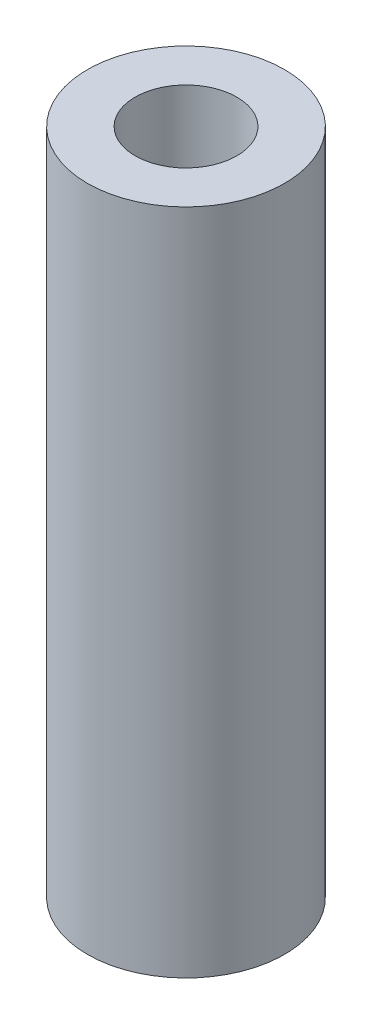
ISO-10303-21;
HEADER;
FILE_DESCRIPTION(('STEP AP214'),'2;1');
FILE_NAME('part.step','',(''),(''),'','','');
FILE_SCHEMA(('AUTOMOTIVE_DESIGN { 1 0 10303 214 1 1 1 1 }'));
ENDSEC;
DATA;
#1=APPLICATION_CONTEXT('core data for automotive mechanical design processes');
#2=APPLICATION_PROTOCOL_DEFINITION('international standard','automotive_design',2000,#1);
#3=PRODUCT_CONTEXT('',#1,'mechanical');
#4=PRODUCT('Part','Part','',(#3));
#5=PRODUCT_RELATED_PRODUCT_CATEGORY('part','',(#4));
#6=PRODUCT_DEFINITION_FORMATION('','',#4);
#7=PRODUCT_DEFINITION_CONTEXT('part definition',#1,'design');
#8=PRODUCT_DEFINITION('design','',#6,#7);
#9=PRODUCT_DEFINITION_SHAPE('','',#8);
#10=(LENGTH_UNIT() NAMED_UNIT(*) SI_UNIT(.MILLI.,.METRE.));
#11=(NAMED_UNIT(*) PLANE_ANGLE_UNIT() SI_UNIT($,.RADIAN.));
#12=(NAMED_UNIT(*) SI_UNIT($,.STERADIAN.) SOLID_ANGLE_UNIT());
#13=UNCERTAINTY_MEASURE_WITH_UNIT(LENGTH_MEASURE(1.E-05),#10,'distance_accuracy_value','');
#14=(GEOMETRIC_REPRESENTATION_CONTEXT(3) GLOBAL_UNCERTAINTY_ASSIGNED_CONTEXT((#13)) GLOBAL_UNIT_ASSIGNED_CONTEXT((#10,
#11,#12)) REPRESENTATION_CONTEXT('',''));
#15=CARTESIAN_POINT('',(0.,0.,0.));
#16=DIRECTION('',(0.,0.,1.));
#17=DIRECTION('',(1.,0.,0.));
#18=AXIS2_PLACEMENT_3D('',#15,#16,#17);
#19=CARTESIAN_POINT('',(0.,21.,0.));
#20=DIRECTION('',(0.,1.,0.));
#21=DIRECTION('',(0.,0.,1.));
#22=AXIS2_PLACEMENT_3D('',#19,#20,#21);
#23=PLANE('',#22);
#24=CARTESIAN_POINT('',(0.,21.,0.));
#25=DIRECTION('',(0.,1.,0.));
#26=DIRECTION('',(0.,0.,1.));
#27=AXIS2_PLACEMENT_3D('',#24,#25,#26);
#28=CIRCLE('',#27,3.1);
#29=CARTESIAN_POINT('',(0.,21.,-3.1));
#30=VERTEX_POINT('',#29);
#31=EDGE_CURVE('E10',#30,#30,#28,.T.);
#32=ORIENTED_EDGE('',*,*,#31,.T.);
#33=EDGE_LOOP('',(#32));
#34=FACE_BOUND('',#33,.T.);
#35=CARTESIAN_POINT('',(0.,21.,0.));
#36=DIRECTION('',(0.,1.,0.));
#37=DIRECTION('',(0.,0.,1.));
#38=AXIS2_PLACEMENT_3D('',#35,#36,#37);
#39=CIRCLE('',#38,1.6);
#40=CARTESIAN_POINT('',(0.,21.,-1.6));
#41=VERTEX_POINT('',#40);
#42=EDGE_CURVE('E50',#41,#41,#39,.T.);
#43=ORIENTED_EDGE('',*,*,#42,.F.);
#44=EDGE_LOOP('',(#43));
#45=FACE_BOUND('',#44,.T.);
#46=ADVANCED_FACE('F37',(#34,#45),#23,.T.);
#47=CARTESIAN_POINT('',(0.,0.,0.));
#48=DIRECTION('',(0.,1.,0.));
#49=DIRECTION('',(0.,0.,1.));
#50=AXIS2_PLACEMENT_3D('',#47,#48,#49);
#51=PLANE('',#50);
#52=CARTESIAN_POINT('',(0.,0.,0.));
#53=DIRECTION('',(0.,1.,0.));
#54=DIRECTION('',(0.,0.,1.));
#55=AXIS2_PLACEMENT_3D('',#52,#53,#54);
#56=CIRCLE('',#55,3.1);
#57=CARTESIAN_POINT('',(0.,0.,-3.1));
#58=VERTEX_POINT('',#57);
#59=EDGE_CURVE('E41',#58,#58,#56,.T.);
#60=ORIENTED_EDGE('',*,*,#59,.F.);
#61=EDGE_LOOP('',(#60));
#62=FACE_BOUND('',#61,.T.);
#63=CARTESIAN_POINT('',(0.,0.,0.));
#64=DIRECTION('',(0.,1.,0.));
#65=DIRECTION('',(0.,0.,1.));
#66=AXIS2_PLACEMENT_3D('',#63,#64,#65);
#67=CIRCLE('',#66,1.6);
#68=CARTESIAN_POINT('',(0.,0.,-1.6));
#69=VERTEX_POINT('',#68);
#70=EDGE_CURVE('E52',#69,#69,#67,.T.);
#71=ORIENTED_EDGE('',*,*,#70,.T.);
#72=EDGE_LOOP('',(#71));
#73=FACE_BOUND('',#72,.T.);
#74=ADVANCED_FACE('F64',(#62,#73),#51,.F.);
#75=CARTESIAN_POINT('',(0.,21.,0.));
#76=DIRECTION('',(0.,-1.,0.));
#77=DIRECTION('',(0.,0.,-1.));
#78=AXIS2_PLACEMENT_3D('',#75,#76,#77);
#79=CYLINDRICAL_SURFACE('',#78,3.1);
#80=CARTESIAN_POINT('',(0.,21.,-3.1));
#81=CARTESIAN_POINT('',(0.,20.78125,-3.1));
#82=CARTESIAN_POINT('',(0.,20.5625,-3.1));
#83=CARTESIAN_POINT('',(0.,20.125,-3.1));
#84=CARTESIAN_POINT('',(0.,19.90625,-3.1));
#85=CARTESIAN_POINT('',(0.,19.46875,-3.1));
#86=CARTESIAN_POINT('',(0.,19.25,-3.1));
#87=CARTESIAN_POINT('',(0.,18.8125,-3.1));
#88=CARTESIAN_POINT('',(0.,18.59375,-3.1));
#89=CARTESIAN_POINT('',(0.,18.15625,-3.1));
#90=CARTESIAN_POINT('',(0.,17.9375,-3.1));
#91=CARTESIAN_POINT('',(0.,17.5,-3.1));
#92=CARTESIAN_POINT('',(0.,17.28125,-3.1));
#93=CARTESIAN_POINT('',(0.,16.84375,-3.1));
#94=CARTESIAN_POINT('',(0.,16.625,-3.1));
#95=CARTESIAN_POINT('',(0.,16.1875,-3.1));
#96=CARTESIAN_POINT('',(0.,15.96875,-3.1));
#97=CARTESIAN_POINT('',(0.,15.53125,-3.1));
#98=CARTESIAN_POINT('',(0.,15.3125,-3.1));
#99=CARTESIAN_POINT('',(0.,14.875,-3.1));
#100=CARTESIAN_POINT('',(0.,14.65625,-3.1));
#101=CARTESIAN_POINT('',(0.,14.21875,-3.1));
#102=CARTESIAN_POINT('',(0.,14.,-3.1));
#103=CARTESIAN_POINT('',(0.,13.5625,-3.1));
#104=CARTESIAN_POINT('',(0.,13.34375,-3.1));
#105=CARTESIAN_POINT('',(0.,12.90625,-3.1));
#106=CARTESIAN_POINT('',(0.,12.6875,-3.1));
#107=CARTESIAN_POINT('',(0.,12.25,-3.1));
#108=CARTESIAN_POINT('',(0.,12.03125,-3.1));
#109=CARTESIAN_POINT('',(0.,11.59375,-3.1));
#110=CARTESIAN_POINT('',(0.,11.375,-3.1));
#111=CARTESIAN_POINT('',(0.,10.9375,-3.1));
#112=CARTESIAN_POINT('',(0.,10.71875,-3.1));
#113=CARTESIAN_POINT('',(0.,10.28125,-3.1));
#114=CARTESIAN_POINT('',(0.,10.0625,-3.1));
#115=CARTESIAN_POINT('',(0.,9.625,-3.1));
#116=CARTESIAN_POINT('',(0.,9.40625,-3.1));
#117=CARTESIAN_POINT('',(0.,8.96875,-3.1));
#118=CARTESIAN_POINT('',(0.,8.75,-3.1));
#119=CARTESIAN_POINT('',(0.,8.3125,-3.1));
#120=CARTESIAN_POINT('',(0.,8.09375,-3.1));
#121=CARTESIAN_POINT('',(0.,7.65625,-3.1));
#122=CARTESIAN_POINT('',(0.,7.4375,-3.1));
#123=CARTESIAN_POINT('',(0.,7.,-3.1));
#124=CARTESIAN_POINT('',(0.,6.78125,-3.1));
#125=CARTESIAN_POINT('',(0.,6.34375,-3.1));
#126=CARTESIAN_POINT('',(0.,6.125,-3.1));
#127=CARTESIAN_POINT('',(0.,5.6875,-3.1));
#128=CARTESIAN_POINT('',(0.,5.46875,-3.1));
#129=CARTESIAN_POINT('',(0.,5.03125,-3.1));
#130=CARTESIAN_POINT('',(0.,4.8125,-3.1));
#131=CARTESIAN_POINT('',(0.,4.375,-3.1));
#132=CARTESIAN_POINT('',(0.,4.15625,-3.1));
#133=CARTESIAN_POINT('',(0.,3.71875,-3.1));
#134=CARTESIAN_POINT('',(0.,3.5,-3.1));
#135=CARTESIAN_POINT('',(0.,3.0625,-3.1));
#136=CARTESIAN_POINT('',(0.,2.84375,-3.1));
#137=CARTESIAN_POINT('',(0.,2.40625,-3.1));
#138=CARTESIAN_POINT('',(0.,2.1875,-3.1));
#139=CARTESIAN_POINT('',(0.,1.75,-3.1));
#140=CARTESIAN_POINT('',(0.,1.53125,-3.1));
#141=CARTESIAN_POINT('',(0.,1.09375,-3.1));
#142=CARTESIAN_POINT('',(0.,0.875000000000001,-3.1));
#143=CARTESIAN_POINT('',(0.,0.4375,-3.1));
#144=CARTESIAN_POINT('',(0.,0.21875,-3.1));
#145=CARTESIAN_POINT('',(0.,0.,-3.1));
#146=B_SPLINE_CURVE_WITH_KNOTS('',3,(#80,#81,#82,#83,#84,#85,#86,#87,#88,#89,#90,#91,#92,#93,
#94,#95,#96,#97,#98,#99,#100,#101,#102,#103,#104,#105,#106,#107,#108,#109,#110,#111,#112,#113,
#114,#115,#116,#117,#118,#119,#120,#121,#122,#123,#124,#125,#126,#127,#128,#129,#130,#131,#132,
#133,#134,#135,#136,#137,#138,#139,#140,#141,#142,#143,#144,#145),.UNSPECIFIED.,.F.,.F.,(4,2,2,
2,2,2,2,2,2,2,2,2,2,2,2,2,2,2,2,2,2,2,2,2,2,2,2,2,2,2,2,2,4),(0.,0.656250000000001,1.3125,
1.96875,2.625,3.28125,3.9375,4.59375,5.25,5.90625,6.5625,7.21875,7.875,8.53125,9.1875,9.84375,
10.5,11.15625,11.8125,12.46875,13.125,13.78125,14.4375,15.09375,15.75,16.40625,17.0625,17.71875,
18.375,19.03125,19.6875,20.34375,21.),.UNSPECIFIED.);
#147=EDGE_CURVE('BSEAM39',#30,#58,#146,.T.);
#148=ORIENTED_EDGE('',*,*,#31,.F.);
#149=ORIENTED_EDGE('',*,*,#59,.T.);
#150=ORIENTED_EDGE('',*,*,#147,.T.);
#151=ORIENTED_EDGE('',*,*,#147,.F.);
#152=EDGE_LOOP('',(#148,#150,#149,#151));
#153=FACE_BOUND('',#152,.T.);
#154=ADVANCED_FACE('F39',(#153),#79,.T.);
#155=CARTESIAN_POINT('',(0.,21.,0.));
#156=DIRECTION('',(0.,-1.,0.));
#157=DIRECTION('',(0.,0.,-1.));
#158=AXIS2_PLACEMENT_3D('',#155,#156,#157);
#159=CYLINDRICAL_SURFACE('',#158,1.6);
#160=CARTESIAN_POINT('',(0.,21.,-1.6));
#161=CARTESIAN_POINT('',(0.,20.78125,-1.6));
#162=CARTESIAN_POINT('',(0.,20.5625,-1.6));
#163=CARTESIAN_POINT('',(0.,20.125,-1.6));
#164=CARTESIAN_POINT('',(0.,19.90625,-1.6));
#165=CARTESIAN_POINT('',(0.,19.46875,-1.6));
#166=CARTESIAN_POINT('',(0.,19.25,-1.6));
#167=CARTESIAN_POINT('',(0.,18.8125,-1.6));
#168=CARTESIAN_POINT('',(0.,18.59375,-1.6));
#169=CARTESIAN_POINT('',(0.,18.15625,-1.6));
#170=CARTESIAN_POINT('',(0.,17.9375,-1.6));
#171=CARTESIAN_POINT('',(0.,17.5,-1.6));
#172=CARTESIAN_POINT('',(0.,17.28125,-1.6));
#173=CARTESIAN_POINT('',(0.,16.84375,-1.6));
#174=CARTESIAN_POINT('',(0.,16.625,-1.6));
#175=CARTESIAN_POINT('',(0.,16.1875,-1.6));
#176=CARTESIAN_POINT('',(0.,15.96875,-1.6));
#177=CARTESIAN_POINT('',(0.,15.53125,-1.6));
#178=CARTESIAN_POINT('',(0.,15.3125,-1.6));
#179=CARTESIAN_POINT('',(0.,14.875,-1.6));
#180=CARTESIAN_POINT('',(0.,14.65625,-1.6));
#181=CARTESIAN_POINT('',(0.,14.21875,-1.6));
#182=CARTESIAN_POINT('',(0.,14.,-1.6));
#183=CARTESIAN_POINT('',(0.,13.5625,-1.6));
#184=CARTESIAN_POINT('',(0.,13.34375,-1.6));
#185=CARTESIAN_POINT('',(0.,12.90625,-1.6));
#186=CARTESIAN_POINT('',(0.,12.6875,-1.6));
#187=CARTESIAN_POINT('',(0.,12.25,-1.6));
#188=CARTESIAN_POINT('',(0.,12.03125,-1.6));
#189=CARTESIAN_POINT('',(0.,11.59375,-1.6));
#190=CARTESIAN_POINT('',(0.,11.375,-1.6));
#191=CARTESIAN_POINT('',(0.,10.9375,-1.6));
#192=CARTESIAN_POINT('',(0.,10.71875,-1.6));
#193=CARTESIAN_POINT('',(0.,10.28125,-1.6));
#194=CARTESIAN_POINT('',(0.,10.0625,-1.6));
#195=CARTESIAN_POINT('',(0.,9.625,-1.6));
#196=CARTESIAN_POINT('',(0.,9.40625,-1.6));
#197=CARTESIAN_POINT('',(0.,8.96875,-1.6));
#198=CARTESIAN_POINT('',(0.,8.75,-1.6));
#199=CARTESIAN_POINT('',(0.,8.3125,-1.6));
#200=CARTESIAN_POINT('',(0.,8.09375,-1.6));
#201=CARTESIAN_POINT('',(0.,7.65625,-1.6));
#202=CARTESIAN_POINT('',(0.,7.4375,-1.6));
#203=CARTESIAN_POINT('',(0.,7.,-1.6));
#204=CARTESIAN_POINT('',(0.,6.78125,-1.6));
#205=CARTESIAN_POINT('',(0.,6.34375,-1.6));
#206=CARTESIAN_POINT('',(0.,6.125,-1.6));
#207=CARTESIAN_POINT('',(0.,5.6875,-1.6));
#208=CARTESIAN_POINT('',(0.,5.46875,-1.6));
#209=CARTESIAN_POINT('',(0.,5.03125,-1.6));
#210=CARTESIAN_POINT('',(0.,4.8125,-1.6));
#211=CARTESIAN_POINT('',(0.,4.375,-1.6));
#212=CARTESIAN_POINT('',(0.,4.15625,-1.6));
#213=CARTESIAN_POINT('',(0.,3.71875,-1.6));
#214=CARTESIAN_POINT('',(0.,3.5,-1.6));
#215=CARTESIAN_POINT('',(0.,3.0625,-1.6));
#216=CARTESIAN_POINT('',(0.,2.84375,-1.6));
#217=CARTESIAN_POINT('',(0.,2.40625,-1.6));
#218=CARTESIAN_POINT('',(0.,2.1875,-1.6));
#219=CARTESIAN_POINT('',(0.,1.75,-1.6));
#220=CARTESIAN_POINT('',(0.,1.53125,-1.6));
#221=CARTESIAN_POINT('',(0.,1.09375,-1.6));
#222=CARTESIAN_POINT('',(0.,0.875000000000001,-1.6));
#223=CARTESIAN_POINT('',(0.,0.4375,-1.6));
#224=CARTESIAN_POINT('',(0.,0.21875,-1.6));
#225=CARTESIAN_POINT('',(0.,0.,-1.6));
#226=B_SPLINE_CURVE_WITH_KNOTS('',3,(#160,#161,#162,#163,#164,#165,#166,#167,#168,#169,#170,
#171,#172,#173,#174,#175,#176,#177,#178,#179,#180,#181,#182,#183,#184,#185,#186,#187,#188,#189,
#190,#191,#192,#193,#194,#195,#196,#197,#198,#199,#200,#201,#202,#203,#204,#205,#206,#207,#208,
#209,#210,#211,#212,#213,#214,#215,#216,#217,#218,#219,#220,#221,#222,#223,#224,#225),
.UNSPECIFIED.,.F.,.F.,(4,2,2,2,2,2,2,2,2,2,2,2,2,2,2,2,2,2,2,2,2,2,2,2,2,2,2,2,2,2,2,2,4),(0.,
0.656249999999997,1.3125,1.96875,2.625,3.28125,3.9375,4.59375,5.25,5.90625,6.5625,7.21875,7.875,
8.53125,9.1875,9.84375,10.5,11.15625,11.8125,12.46875,13.125,13.78125,14.4375,15.09375,15.75,
16.40625,17.0625,17.71875,18.375,19.03125,19.6875,20.34375,21.),.UNSPECIFIED.);
#227=EDGE_CURVE('BSEAM60',#41,#69,#226,.T.);
#228=ORIENTED_EDGE('',*,*,#42,.T.);
#229=ORIENTED_EDGE('',*,*,#70,.F.);
#230=ORIENTED_EDGE('',*,*,#227,.T.);
#231=ORIENTED_EDGE('',*,*,#227,.F.);
#232=EDGE_LOOP('',(#228,#230,#229,#231));
#233=FACE_BOUND('',#232,.T.);
#234=ADVANCED_FACE('F60',(#233),#159,.F.);
#235=CLOSED_SHELL('',(#46,#74,#154,#234));
#236=MANIFOLD_SOLID_BREP('B2',#235);
#237=ADVANCED_BREP_SHAPE_REPRESENTATION('',(#18,#236),#14);
#238=SHAPE_DEFINITION_REPRESENTATION(#9,#237);
ENDSEC;
END-ISO-10303-21;
